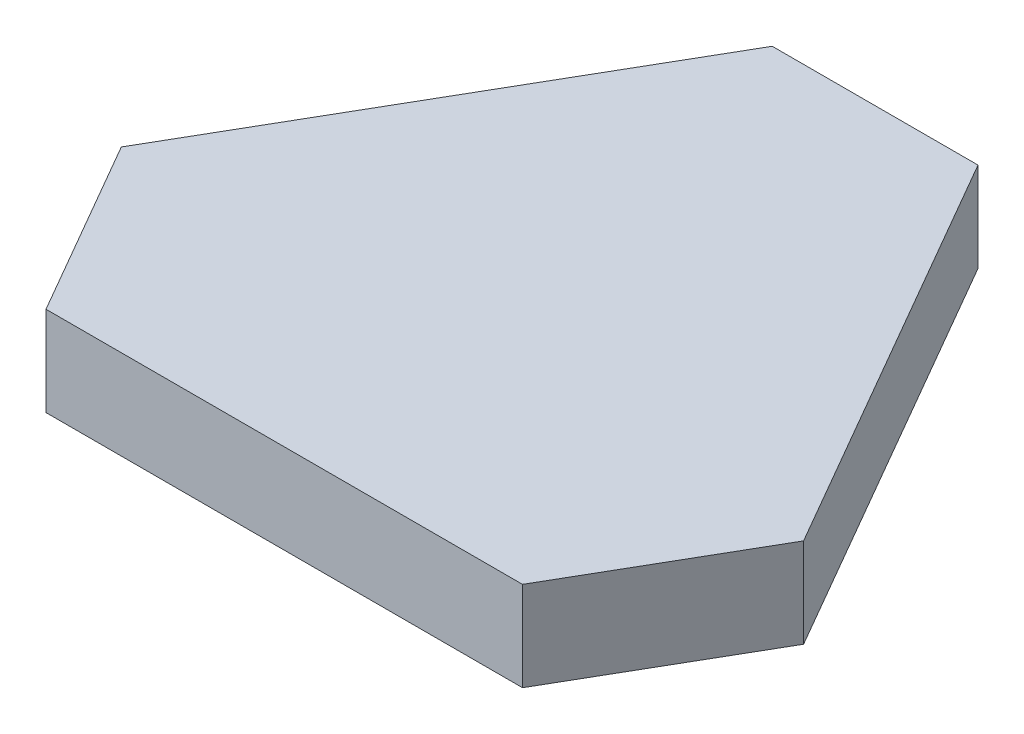
ISO-10303-21;
HEADER;
FILE_DESCRIPTION(('STEP AP214'),'2;1');
FILE_NAME('part.step','',(''),(''),'','','');
FILE_SCHEMA(('AUTOMOTIVE_DESIGN { 1 0 10303 214 1 1 1 1 }'));
ENDSEC;
DATA;
#1=APPLICATION_CONTEXT('core data for automotive mechanical design processes');
#2=APPLICATION_PROTOCOL_DEFINITION('international standard','automotive_design',2000,#1);
#3=PRODUCT_CONTEXT('',#1,'mechanical');
#4=PRODUCT('Part','Part','',(#3));
#5=PRODUCT_RELATED_PRODUCT_CATEGORY('part','',(#4));
#6=PRODUCT_DEFINITION_FORMATION('','',#4);
#7=PRODUCT_DEFINITION_CONTEXT('part definition',#1,'design');
#8=PRODUCT_DEFINITION('design','',#6,#7);
#9=PRODUCT_DEFINITION_SHAPE('','',#8);
#10=(LENGTH_UNIT() NAMED_UNIT(*) SI_UNIT(.MILLI.,.METRE.));
#11=(NAMED_UNIT(*) PLANE_ANGLE_UNIT() SI_UNIT($,.RADIAN.));
#12=(NAMED_UNIT(*) SI_UNIT($,.STERADIAN.) SOLID_ANGLE_UNIT());
#13=UNCERTAINTY_MEASURE_WITH_UNIT(LENGTH_MEASURE(1.E-05),#10,'distance_accuracy_value','');
#14=(GEOMETRIC_REPRESENTATION_CONTEXT(3) GLOBAL_UNCERTAINTY_ASSIGNED_CONTEXT((#13)) GLOBAL_UNIT_ASSIGNED_CONTEXT((#10,
#11,#12)) REPRESENTATION_CONTEXT('',''));
#15=CARTESIAN_POINT('',(0.,0.,0.));
#16=DIRECTION('',(0.,0.,1.));
#17=DIRECTION('',(1.,0.,0.));
#18=AXIS2_PLACEMENT_3D('',#15,#16,#17);
#19=CARTESIAN_POINT('',(11.4914703891344,15.,-176.));
#20=DIRECTION('',(0.,0.,1.));
#21=DIRECTION('',(1.,0.,0.));
#22=AXIS2_PLACEMENT_3D('',#19,#20,#21);
#23=PLANE('',#22);
#24=DIRECTION('',(-1.,0.,0.));
#25=VECTOR('',#24,1.);
#26=CARTESIAN_POINT('',(11.4914703891344,5.,-176.));
#27=LINE('',#26,#25);
#28=CARTESIAN_POINT('',(11.4914703891344,5.,-176.));
#29=VERTEX_POINT('',#28);
#30=CARTESIAN_POINT('',(-11.4914703891369,5.,-176.));
#31=VERTEX_POINT('',#30);
#32=EDGE_CURVE('E90',#29,#31,#27,.T.);
#33=ORIENTED_EDGE('',*,*,#32,.T.);
#34=DIRECTION('',(0.,-1.,0.));
#35=VECTOR('',#34,1.);
#36=CARTESIAN_POINT('',(-11.4914703891369,15.,-176.));
#37=LINE('',#36,#35);
#38=CARTESIAN_POINT('',(-11.4914703891369,15.,-176.));
#39=VERTEX_POINT('',#38);
#40=EDGE_CURVE('E11',#39,#31,#37,.T.);
#41=ORIENTED_EDGE('',*,*,#40,.F.);
#42=DIRECTION('',(-1.,0.,0.));
#43=VECTOR('',#42,1.);
#44=CARTESIAN_POINT('',(11.4914703891344,15.,-176.));
#45=LINE('',#44,#43);
#46=CARTESIAN_POINT('',(11.4914703891344,15.,-176.));
#47=VERTEX_POINT('',#46);
#48=EDGE_CURVE('E93',#47,#39,#45,.T.);
#49=ORIENTED_EDGE('',*,*,#48,.F.);
#50=DIRECTION('',(0.,-1.,0.));
#51=VECTOR('',#50,1.);
#52=CARTESIAN_POINT('',(11.4914703891344,15.,-176.));
#53=LINE('',#52,#51);
#54=EDGE_CURVE('E101',#47,#29,#53,.T.);
#55=ORIENTED_EDGE('',*,*,#54,.T.);
#56=EDGE_LOOP('',(#33,#41,#49,#55));
#57=FACE_BOUND('',#56,.T.);
#58=ADVANCED_FACE('F35',(#57),#23,.F.);
#59=CARTESIAN_POINT('',(-11.4914703891369,15.,-176.));
#60=DIRECTION('',(0.866025403784444,0.,0.499999999999991));
#61=DIRECTION('',(0.499999999999991,0.,-0.866025403784444));
#62=AXIS2_PLACEMENT_3D('',#59,#60,#61);
#63=PLANE('',#62);
#64=DIRECTION('',(-0.499999999999991,0.,0.866025403784444));
#65=VECTOR('',#64,1.);
#66=CARTESIAN_POINT('',(-11.4914703891369,5.,-176.));
#67=LINE('',#66,#65);
#68=CARTESIAN_POINT('',(-38.10511776651,5.,-129.903810567666));
#69=VERTEX_POINT('',#68);
#70=EDGE_CURVE('E128',#31,#69,#67,.T.);
#71=ORIENTED_EDGE('',*,*,#70,.T.);
#72=DIRECTION('',(0.,-1.,0.));
#73=VECTOR('',#72,1.);
#74=CARTESIAN_POINT('',(-38.10511776651,15.,-129.903810567666));
#75=LINE('',#74,#73);
#76=CARTESIAN_POINT('',(-38.10511776651,15.,-129.903810567666));
#77=VERTEX_POINT('',#76);
#78=EDGE_CURVE('E43',#77,#69,#75,.T.);
#79=ORIENTED_EDGE('',*,*,#78,.F.);
#80=DIRECTION('',(-0.499999999999991,0.,0.866025403784444));
#81=VECTOR('',#80,1.);
#82=CARTESIAN_POINT('',(-11.4914703891369,15.,-176.));
#83=LINE('',#82,#81);
#84=EDGE_CURVE('E127',#39,#77,#83,.T.);
#85=ORIENTED_EDGE('',*,*,#84,.F.);
#86=ORIENTED_EDGE('',*,*,#40,.T.);
#87=EDGE_LOOP('',(#71,#79,#85,#86));
#88=FACE_BOUND('',#87,.T.);
#89=ADVANCED_FACE('F126',(#88),#63,.F.);
#90=CARTESIAN_POINT('',(-38.10511776651,15.,-129.903810567666));
#91=DIRECTION('',(0.866025403784439,0.,-0.499999999999999));
#92=DIRECTION('',(-0.499999999999999,0.,-0.866025403784439));
#93=AXIS2_PLACEMENT_3D('',#90,#91,#92);
#94=PLANE('',#93);
#95=DIRECTION('',(0.499999999999999,0.,0.866025403784439));
#96=VECTOR('',#95,1.);
#97=CARTESIAN_POINT('',(-38.10511776651,5.,-129.903810567666));
#98=LINE('',#97,#96);
#99=CARTESIAN_POINT('',(-26.6136473773685,5.,-110.));
#100=VERTEX_POINT('',#99);
#101=EDGE_CURVE('E108',#69,#100,#98,.T.);
#102=ORIENTED_EDGE('',*,*,#101,.T.);
#103=DIRECTION('',(0.,-1.,0.));
#104=VECTOR('',#103,1.);
#105=CARTESIAN_POINT('',(-26.6136473773685,15.,-110.));
#106=LINE('',#105,#104);
#107=CARTESIAN_POINT('',(-26.6136473773685,15.,-110.));
#108=VERTEX_POINT('',#107);
#109=EDGE_CURVE('E114',#108,#100,#106,.T.);
#110=ORIENTED_EDGE('',*,*,#109,.F.);
#111=DIRECTION('',(0.499999999999999,0.,0.866025403784439));
#112=VECTOR('',#111,1.);
#113=CARTESIAN_POINT('',(-38.10511776651,15.,-129.903810567666));
#114=LINE('',#113,#112);
#115=EDGE_CURVE('E123',#77,#108,#114,.T.);
#116=ORIENTED_EDGE('',*,*,#115,.F.);
#117=ORIENTED_EDGE('',*,*,#78,.T.);
#118=EDGE_LOOP('',(#102,#110,#116,#117));
#119=FACE_BOUND('',#118,.T.);
#120=ADVANCED_FACE('F121',(#119),#94,.F.);
#121=CARTESIAN_POINT('',(-26.6136473773685,15.,-110.));
#122=DIRECTION('',(0.,0.,-1.));
#123=DIRECTION('',(-1.,0.,0.));
#124=AXIS2_PLACEMENT_3D('',#121,#122,#123);
#125=PLANE('',#124);
#126=DIRECTION('',(1.,0.,0.));
#127=VECTOR('',#126,1.);
#128=CARTESIAN_POINT('',(-26.6136473773685,5.,-110.));
#129=LINE('',#128,#127);
#130=CARTESIAN_POINT('',(26.6136473773675,5.,-110.));
#131=VERTEX_POINT('',#130);
#132=EDGE_CURVE('E106',#100,#131,#129,.T.);
#133=ORIENTED_EDGE('',*,*,#132,.T.);
#134=DIRECTION('',(0.,-1.,0.));
#135=VECTOR('',#134,1.);
#136=CARTESIAN_POINT('',(26.6136473773675,15.,-110.));
#137=LINE('',#136,#135);
#138=CARTESIAN_POINT('',(26.6136473773675,15.,-110.));
#139=VERTEX_POINT('',#138);
#140=EDGE_CURVE('E100',#139,#131,#137,.T.);
#141=ORIENTED_EDGE('',*,*,#140,.F.);
#142=DIRECTION('',(1.,0.,0.));
#143=VECTOR('',#142,1.);
#144=CARTESIAN_POINT('',(-26.6136473773685,15.,-110.));
#145=LINE('',#144,#143);
#146=EDGE_CURVE('E136',#108,#139,#145,.T.);
#147=ORIENTED_EDGE('',*,*,#146,.F.);
#148=ORIENTED_EDGE('',*,*,#109,.T.);
#149=EDGE_LOOP('',(#133,#141,#147,#148));
#150=FACE_BOUND('',#149,.T.);
#151=ADVANCED_FACE('F150',(#150),#125,.F.);
#152=CARTESIAN_POINT('',(26.6136473773675,15.,-110.));
#153=DIRECTION('',(-0.866025403784434,0.,-0.500000000000008));
#154=DIRECTION('',(-0.500000000000008,0.,0.866025403784434));
#155=AXIS2_PLACEMENT_3D('',#152,#153,#154);
#156=PLANE('',#155);
#157=DIRECTION('',(0.500000000000008,0.,-0.866025403784434));
#158=VECTOR('',#157,1.);
#159=CARTESIAN_POINT('',(26.6136473773675,5.,-110.));
#160=LINE('',#159,#158);
#161=CARTESIAN_POINT('',(38.105117766509,5.,-129.903810567666));
#162=VERTEX_POINT('',#161);
#163=EDGE_CURVE('E87',#131,#162,#160,.T.);
#164=ORIENTED_EDGE('',*,*,#163,.T.);
#165=DIRECTION('',(0.,-1.,0.));
#166=VECTOR('',#165,1.);
#167=CARTESIAN_POINT('',(38.105117766509,15.,-129.903810567666));
#168=LINE('',#167,#166);
#169=CARTESIAN_POINT('',(38.105117766509,15.,-129.903810567666));
#170=VERTEX_POINT('',#169);
#171=EDGE_CURVE('E96',#170,#162,#168,.T.);
#172=ORIENTED_EDGE('',*,*,#171,.F.);
#173=DIRECTION('',(0.500000000000008,0.,-0.866025403784434));
#174=VECTOR('',#173,1.);
#175=CARTESIAN_POINT('',(26.6136473773675,15.,-110.));
#176=LINE('',#175,#174);
#177=EDGE_CURVE('E134',#139,#170,#176,.T.);
#178=ORIENTED_EDGE('',*,*,#177,.F.);
#179=ORIENTED_EDGE('',*,*,#140,.T.);
#180=EDGE_LOOP('',(#164,#172,#178,#179));
#181=FACE_BOUND('',#180,.T.);
#182=ADVANCED_FACE('F104',(#181),#156,.F.);
#183=CARTESIAN_POINT('',(38.105117766509,15.,-129.903810567666));
#184=DIRECTION('',(-0.866025403784435,0.,0.500000000000007));
#185=DIRECTION('',(0.500000000000007,0.,0.866025403784435));
#186=AXIS2_PLACEMENT_3D('',#183,#184,#185);
#187=PLANE('',#186);
#188=DIRECTION('',(-0.500000000000007,0.,-0.866025403784435));
#189=VECTOR('',#188,1.);
#190=CARTESIAN_POINT('',(38.105117766509,5.,-129.903810567666));
#191=LINE('',#190,#189);
#192=EDGE_CURVE('E83',#162,#29,#191,.T.);
#193=ORIENTED_EDGE('',*,*,#192,.T.);
#194=ORIENTED_EDGE('',*,*,#54,.F.);
#195=DIRECTION('',(-0.500000000000007,0.,-0.866025403784435));
#196=VECTOR('',#195,1.);
#197=CARTESIAN_POINT('',(38.105117766509,15.,-129.903810567666));
#198=LINE('',#197,#196);
#199=EDGE_CURVE('E50',#170,#47,#198,.T.);
#200=ORIENTED_EDGE('',*,*,#199,.F.);
#201=ORIENTED_EDGE('',*,*,#171,.T.);
#202=EDGE_LOOP('',(#193,#194,#200,#201));
#203=FACE_BOUND('',#202,.T.);
#204=ADVANCED_FACE('F97',(#203),#187,.F.);
#205=CARTESIAN_POINT('',(0.,15.,0.));
#206=DIRECTION('',(0.,1.,0.));
#207=DIRECTION('',(0.,0.,1.));
#208=AXIS2_PLACEMENT_3D('',#205,#206,#207);
#209=PLANE('',#208);
#210=ORIENTED_EDGE('',*,*,#48,.T.);
#211=ORIENTED_EDGE('',*,*,#84,.T.);
#212=ORIENTED_EDGE('',*,*,#115,.T.);
#213=ORIENTED_EDGE('',*,*,#146,.T.);
#214=ORIENTED_EDGE('',*,*,#177,.T.);
#215=ORIENTED_EDGE('',*,*,#199,.T.);
#216=EDGE_LOOP('',(#210,#211,#212,#213,#214,#215));
#217=FACE_BOUND('',#216,.T.);
#218=ADVANCED_FACE('F141',(#217),#209,.T.);
#219=CARTESIAN_POINT('',(0.,5.,0.));
#220=DIRECTION('',(0.,1.,0.));
#221=DIRECTION('',(0.,0.,1.));
#222=AXIS2_PLACEMENT_3D('',#219,#220,#221);
#223=PLANE('',#222);
#224=ORIENTED_EDGE('',*,*,#192,.F.);
#225=ORIENTED_EDGE('',*,*,#163,.F.);
#226=ORIENTED_EDGE('',*,*,#132,.F.);
#227=ORIENTED_EDGE('',*,*,#101,.F.);
#228=ORIENTED_EDGE('',*,*,#70,.F.);
#229=ORIENTED_EDGE('',*,*,#32,.F.);
#230=EDGE_LOOP('',(#224,#225,#226,#227,#228,#229));
#231=FACE_BOUND('',#230,.T.);
#232=ADVANCED_FACE('F85',(#231),#223,.F.);
#233=CLOSED_SHELL('',(#58,#89,#120,#151,#182,#204,#218,#232));
#234=MANIFOLD_SOLID_BREP('B2',#233);
#235=ADVANCED_BREP_SHAPE_REPRESENTATION('',(#18,#234),#14);
#236=SHAPE_DEFINITION_REPRESENTATION(#9,#235);
ENDSEC;
END-ISO-10303-21;
